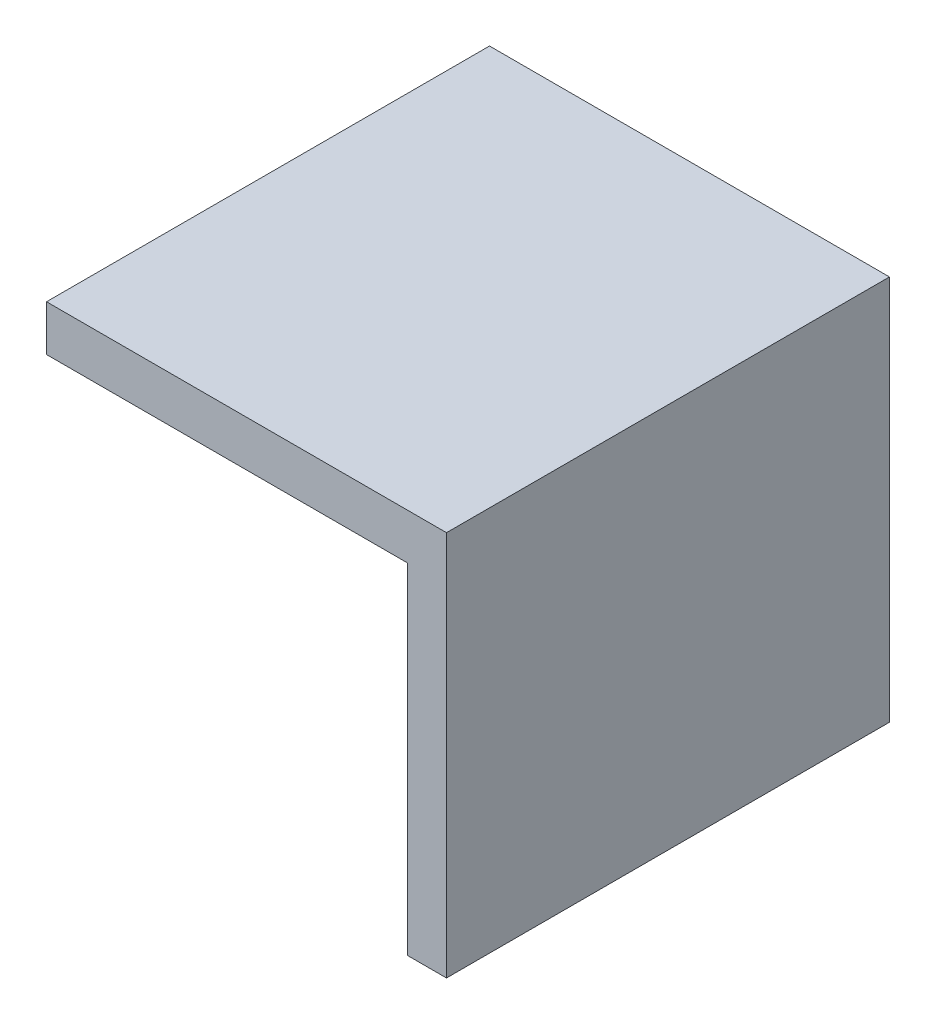
ISO-10303-21;
HEADER;
FILE_DESCRIPTION(('STEP AP214'),'2;1');
FILE_NAME('part.step','',(''),(''),'','','');
FILE_SCHEMA(('AUTOMOTIVE_DESIGN { 1 0 10303 214 1 1 1 1 }'));
ENDSEC;
DATA;
#1=APPLICATION_CONTEXT('core data for automotive mechanical design processes');
#2=APPLICATION_PROTOCOL_DEFINITION('international standard','automotive_design',2000,#1);
#3=PRODUCT_CONTEXT('',#1,'mechanical');
#4=PRODUCT('Part','Part','',(#3));
#5=PRODUCT_RELATED_PRODUCT_CATEGORY('part','',(#4));
#6=PRODUCT_DEFINITION_FORMATION('','',#4);
#7=PRODUCT_DEFINITION_CONTEXT('part definition',#1,'design');
#8=PRODUCT_DEFINITION('design','',#6,#7);
#9=PRODUCT_DEFINITION_SHAPE('','',#8);
#10=(LENGTH_UNIT() NAMED_UNIT(*) SI_UNIT(.MILLI.,.METRE.));
#11=(NAMED_UNIT(*) PLANE_ANGLE_UNIT() SI_UNIT($,.RADIAN.));
#12=(NAMED_UNIT(*) SI_UNIT($,.STERADIAN.) SOLID_ANGLE_UNIT());
#13=UNCERTAINTY_MEASURE_WITH_UNIT(LENGTH_MEASURE(1.E-05),#10,'distance_accuracy_value','');
#14=(GEOMETRIC_REPRESENTATION_CONTEXT(3) GLOBAL_UNCERTAINTY_ASSIGNED_CONTEXT((#13)) GLOBAL_UNIT_ASSIGNED_CONTEXT((#10,
#11,#12)) REPRESENTATION_CONTEXT('',''));
#15=CARTESIAN_POINT('',(0.,0.,0.));
#16=DIRECTION('',(0.,0.,1.));
#17=DIRECTION('',(1.,0.,0.));
#18=AXIS2_PLACEMENT_3D('',#15,#16,#17);
#19=CARTESIAN_POINT('',(40.,4.572,-34.14));
#20=DIRECTION('',(0.,1.,0.));
#21=DIRECTION('',(0.,0.,1.));
#22=AXIS2_PLACEMENT_3D('',#19,#20,#21);
#23=PLANE('',#22);
#24=DIRECTION('',(1.,0.,0.));
#25=VECTOR('',#24,1.);
#26=CARTESIAN_POINT('',(0.,4.572,0.));
#27=LINE('',#26,#25);
#28=CARTESIAN_POINT('',(0.,4.572,0.));
#29=VERTEX_POINT('',#28);
#30=CARTESIAN_POINT('',(40.,4.572,0.));
#31=VERTEX_POINT('',#30);
#32=EDGE_CURVE('E42',#29,#31,#27,.T.);
#33=ORIENTED_EDGE('',*,*,#32,.T.);
#34=DIRECTION('',(0.,0.,-1.));
#35=VECTOR('',#34,1.);
#36=CARTESIAN_POINT('',(40.,4.572,-10.16));
#37=LINE('',#36,#35);
#38=CARTESIAN_POINT('',(40.,4.572,-44.3));
#39=VERTEX_POINT('',#38);
#40=EDGE_CURVE('E11',#31,#39,#37,.T.);
#41=ORIENTED_EDGE('',*,*,#40,.T.);
#42=DIRECTION('',(-1.,0.,0.));
#43=VECTOR('',#42,1.);
#44=CARTESIAN_POINT('',(0.,4.572,-44.3));
#45=LINE('',#44,#43);
#46=CARTESIAN_POINT('',(0.,4.572,-44.3));
#47=VERTEX_POINT('',#46);
#48=EDGE_CURVE('E105',#39,#47,#45,.T.);
#49=ORIENTED_EDGE('',*,*,#48,.T.);
#50=DIRECTION('',(0.,0.,1.));
#51=VECTOR('',#50,1.);
#52=CARTESIAN_POINT('',(0.,4.572,-10.16));
#53=LINE('',#52,#51);
#54=EDGE_CURVE('E48',#47,#29,#53,.T.);
#55=ORIENTED_EDGE('',*,*,#54,.T.);
#56=EDGE_LOOP('',(#33,#41,#49,#55));
#57=FACE_BOUND('',#56,.T.);
#58=ADVANCED_FACE('F38',(#57),#23,.T.);
#59=CARTESIAN_POINT('',(0.,15.2,0.));
#60=DIRECTION('',(0.,0.,-1.));
#61=DIRECTION('',(-1.,0.,0.));
#62=AXIS2_PLACEMENT_3D('',#59,#60,#61);
#63=PLANE('',#62);
#64=ORIENTED_EDGE('',*,*,#32,.F.);
#65=DIRECTION('',(0.,-1.,0.));
#66=VECTOR('',#65,1.);
#67=CARTESIAN_POINT('',(0.,15.2,0.));
#68=LINE('',#67,#66);
#69=CARTESIAN_POINT('',(0.,0.,0.));
#70=VERTEX_POINT('',#69);
#71=EDGE_CURVE('E113',#29,#70,#68,.T.);
#72=ORIENTED_EDGE('',*,*,#71,.T.);
#73=DIRECTION('',(1.,0.,0.));
#74=VECTOR('',#73,1.);
#75=CARTESIAN_POINT('',(0.,0.,0.));
#76=LINE('',#75,#74);
#77=CARTESIAN_POINT('',(36.1,0.,0.));
#78=VERTEX_POINT('',#77);
#79=EDGE_CURVE('E141',#70,#78,#76,.T.);
#80=ORIENTED_EDGE('',*,*,#79,.T.);
#81=DIRECTION('',(0.,1.,0.));
#82=VECTOR('',#81,1.);
#83=CARTESIAN_POINT('',(36.1,-33.996,0.));
#84=LINE('',#83,#82);
#85=CARTESIAN_POINT('',(36.1,-33.996,0.));
#86=VERTEX_POINT('',#85);
#87=EDGE_CURVE('E92',#86,#78,#84,.T.);
#88=ORIENTED_EDGE('',*,*,#87,.F.);
#89=DIRECTION('',(-1.,0.,0.));
#90=VECTOR('',#89,1.);
#91=CARTESIAN_POINT('',(40.,-33.996,0.));
#92=LINE('',#91,#90);
#93=CARTESIAN_POINT('',(40.,-33.996,0.));
#94=VERTEX_POINT('',#93);
#95=EDGE_CURVE('E81',#94,#86,#92,.T.);
#96=ORIENTED_EDGE('',*,*,#95,.F.);
#97=DIRECTION('',(0.,-1.,0.));
#98=VECTOR('',#97,1.);
#99=CARTESIAN_POINT('',(40.,15.2,0.));
#100=LINE('',#99,#98);
#101=EDGE_CURVE('E110',#31,#94,#100,.T.);
#102=ORIENTED_EDGE('',*,*,#101,.F.);
#103=EDGE_LOOP('',(#64,#72,#80,#88,#96,#102));
#104=FACE_BOUND('',#103,.T.);
#105=ADVANCED_FACE('F129',(#104),#63,.F.);
#106=CARTESIAN_POINT('',(0.,15.2,0.));
#107=DIRECTION('',(1.,0.,0.));
#108=DIRECTION('',(0.,0.,-1.));
#109=AXIS2_PLACEMENT_3D('',#106,#107,#108);
#110=PLANE('',#109);
#111=ORIENTED_EDGE('',*,*,#54,.F.);
#112=DIRECTION('',(0.,-1.,0.));
#113=VECTOR('',#112,1.);
#114=CARTESIAN_POINT('',(0.,15.2,-44.3));
#115=LINE('',#114,#113);
#116=CARTESIAN_POINT('',(0.,0.,-44.3));
#117=VERTEX_POINT('',#116);
#118=EDGE_CURVE('E109',#47,#117,#115,.T.);
#119=ORIENTED_EDGE('',*,*,#118,.T.);
#120=DIRECTION('',(0.,0.,1.));
#121=VECTOR('',#120,1.);
#122=CARTESIAN_POINT('',(0.,0.,0.));
#123=LINE('',#122,#121);
#124=EDGE_CURVE('E139',#117,#70,#123,.T.);
#125=ORIENTED_EDGE('',*,*,#124,.T.);
#126=ORIENTED_EDGE('',*,*,#71,.F.);
#127=EDGE_LOOP('',(#111,#119,#125,#126));
#128=FACE_BOUND('',#127,.T.);
#129=ADVANCED_FACE('F138',(#128),#110,.F.);
#130=CARTESIAN_POINT('',(0.,0.,0.));
#131=DIRECTION('',(0.,-1.,0.));
#132=DIRECTION('',(0.,0.,-1.));
#133=AXIS2_PLACEMENT_3D('',#130,#131,#132);
#134=PLANE('',#133);
#135=DIRECTION('',(0.,0.,-1.));
#136=VECTOR('',#135,1.);
#137=CARTESIAN_POINT('',(36.1,0.,0.));
#138=LINE('',#137,#136);
#139=CARTESIAN_POINT('',(36.1,0.,-44.3));
#140=VERTEX_POINT('',#139);
#141=EDGE_CURVE('E89',#78,#140,#138,.T.);
#142=ORIENTED_EDGE('',*,*,#141,.F.);
#143=ORIENTED_EDGE('',*,*,#79,.F.);
#144=ORIENTED_EDGE('',*,*,#124,.F.);
#145=DIRECTION('',(-1.,0.,0.));
#146=VECTOR('',#145,1.);
#147=CARTESIAN_POINT('',(0.,0.,-44.3));
#148=LINE('',#147,#146);
#149=EDGE_CURVE('E56',#140,#117,#148,.T.);
#150=ORIENTED_EDGE('',*,*,#149,.F.);
#151=EDGE_LOOP('',(#142,#143,#144,#150));
#152=FACE_BOUND('',#151,.T.);
#153=ADVANCED_FACE('F143',(#152),#134,.T.);
#154=CARTESIAN_POINT('',(36.1,-33.996,0.));
#155=DIRECTION('',(1.,0.,0.));
#156=DIRECTION('',(0.,0.,-1.));
#157=AXIS2_PLACEMENT_3D('',#154,#155,#156);
#158=PLANE('',#157);
#159=ORIENTED_EDGE('',*,*,#141,.T.);
#160=DIRECTION('',(0.,1.,0.));
#161=VECTOR('',#160,1.);
#162=CARTESIAN_POINT('',(36.1,-33.996,-44.3));
#163=LINE('',#162,#161);
#164=CARTESIAN_POINT('',(36.1,-33.996,-44.3));
#165=VERTEX_POINT('',#164);
#166=EDGE_CURVE('E87',#165,#140,#163,.T.);
#167=ORIENTED_EDGE('',*,*,#166,.F.);
#168=DIRECTION('',(0.,0.,-1.));
#169=VECTOR('',#168,1.);
#170=CARTESIAN_POINT('',(36.1,-33.996,0.));
#171=LINE('',#170,#169);
#172=EDGE_CURVE('E73',#86,#165,#171,.T.);
#173=ORIENTED_EDGE('',*,*,#172,.F.);
#174=ORIENTED_EDGE('',*,*,#87,.T.);
#175=EDGE_LOOP('',(#159,#167,#173,#174));
#176=FACE_BOUND('',#175,.T.);
#177=ADVANCED_FACE('F88',(#176),#158,.F.);
#178=CARTESIAN_POINT('',(0.,-33.996,0.));
#179=DIRECTION('',(0.,-1.,0.));
#180=DIRECTION('',(0.,0.,-1.));
#181=AXIS2_PLACEMENT_3D('',#178,#179,#180);
#182=PLANE('',#181);
#183=ORIENTED_EDGE('',*,*,#95,.T.);
#184=ORIENTED_EDGE('',*,*,#172,.T.);
#185=DIRECTION('',(-1.,0.,0.));
#186=VECTOR('',#185,1.);
#187=CARTESIAN_POINT('',(40.,-33.996,-44.3));
#188=LINE('',#187,#186);
#189=CARTESIAN_POINT('',(40.,-33.996,-44.3));
#190=VERTEX_POINT('',#189);
#191=EDGE_CURVE('E78',#190,#165,#188,.T.);
#192=ORIENTED_EDGE('',*,*,#191,.F.);
#193=DIRECTION('',(0.,0.,-1.));
#194=VECTOR('',#193,1.);
#195=CARTESIAN_POINT('',(40.,-33.996,0.));
#196=LINE('',#195,#194);
#197=EDGE_CURVE('E91',#94,#190,#196,.T.);
#198=ORIENTED_EDGE('',*,*,#197,.F.);
#199=EDGE_LOOP('',(#183,#184,#192,#198));
#200=FACE_BOUND('',#199,.T.);
#201=ADVANCED_FACE('F75',(#200),#182,.T.);
#202=CARTESIAN_POINT('',(40.,15.2,0.));
#203=DIRECTION('',(-1.,0.,0.));
#204=DIRECTION('',(0.,0.,1.));
#205=AXIS2_PLACEMENT_3D('',#202,#203,#204);
#206=PLANE('',#205);
#207=ORIENTED_EDGE('',*,*,#40,.F.);
#208=ORIENTED_EDGE('',*,*,#101,.T.);
#209=ORIENTED_EDGE('',*,*,#197,.T.);
#210=DIRECTION('',(0.,-1.,0.));
#211=VECTOR('',#210,1.);
#212=CARTESIAN_POINT('',(40.,15.2,-44.3));
#213=LINE('',#212,#211);
#214=EDGE_CURVE('E97',#39,#190,#213,.T.);
#215=ORIENTED_EDGE('',*,*,#214,.F.);
#216=EDGE_LOOP('',(#207,#208,#209,#215));
#217=FACE_BOUND('',#216,.T.);
#218=ADVANCED_FACE('F40',(#217),#206,.F.);
#219=CARTESIAN_POINT('',(0.,15.2,-44.3));
#220=DIRECTION('',(0.,0.,1.));
#221=DIRECTION('',(1.,0.,0.));
#222=AXIS2_PLACEMENT_3D('',#219,#220,#221);
#223=PLANE('',#222);
#224=ORIENTED_EDGE('',*,*,#48,.F.);
#225=ORIENTED_EDGE('',*,*,#214,.T.);
#226=ORIENTED_EDGE('',*,*,#191,.T.);
#227=ORIENTED_EDGE('',*,*,#166,.T.);
#228=ORIENTED_EDGE('',*,*,#149,.T.);
#229=ORIENTED_EDGE('',*,*,#118,.F.);
#230=EDGE_LOOP('',(#224,#225,#226,#227,#228,#229));
#231=FACE_BOUND('',#230,.T.);
#232=ADVANCED_FACE('F95',(#231),#223,.F.);
#233=CLOSED_SHELL('',(#58,#105,#129,#153,#177,#201,#218,#232));
#234=MANIFOLD_SOLID_BREP('B2',#233);
#235=ADVANCED_BREP_SHAPE_REPRESENTATION('',(#18,#234),#14);
#236=SHAPE_DEFINITION_REPRESENTATION(#9,#235);
ENDSEC;
END-ISO-10303-21;
